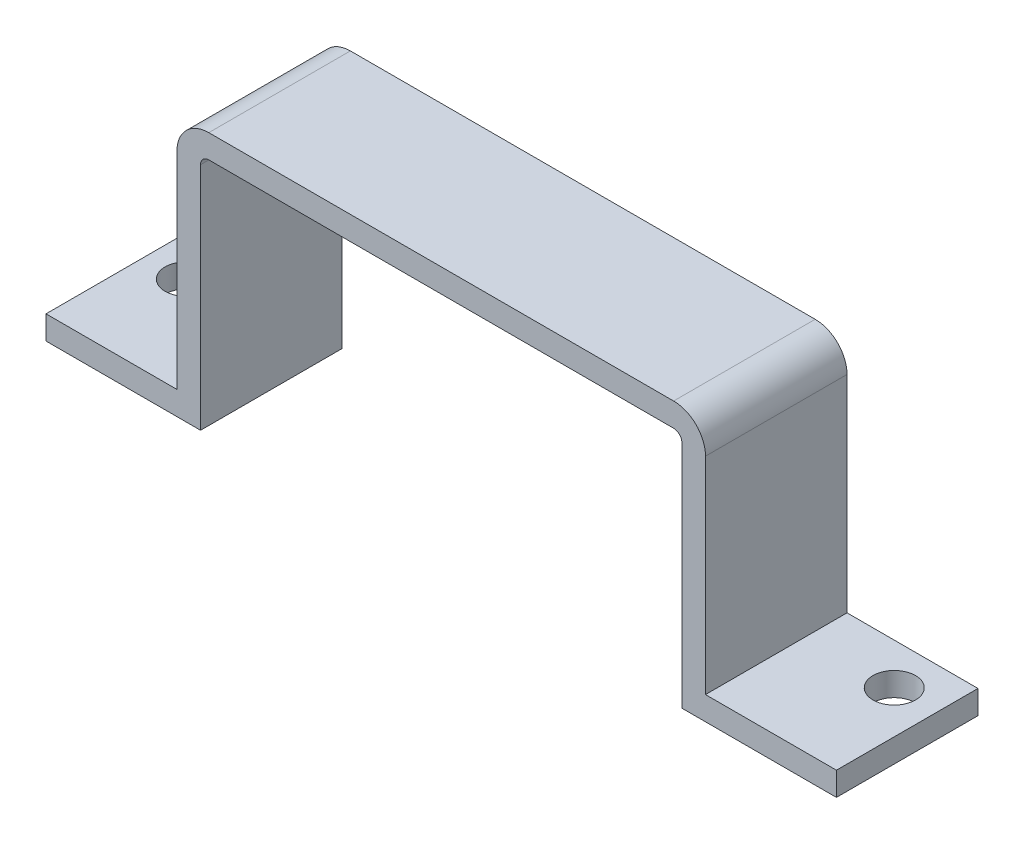
ISO-10303-21;
HEADER;
FILE_DESCRIPTION(('STEP AP214'),'2;1');
FILE_NAME('part.step','',(''),(''),'','','');
FILE_SCHEMA(('AUTOMOTIVE_DESIGN { 1 0 10303 214 1 1 1 1 }'));
ENDSEC;
DATA;
#1=APPLICATION_CONTEXT('core data for automotive mechanical design processes');
#2=APPLICATION_PROTOCOL_DEFINITION('international standard','automotive_design',2000,#1);
#3=PRODUCT_CONTEXT('',#1,'mechanical');
#4=PRODUCT('Part','Part','',(#3));
#5=PRODUCT_RELATED_PRODUCT_CATEGORY('part','',(#4));
#6=PRODUCT_DEFINITION_FORMATION('','',#4);
#7=PRODUCT_DEFINITION_CONTEXT('part definition',#1,'design');
#8=PRODUCT_DEFINITION('design','',#6,#7);
#9=PRODUCT_DEFINITION_SHAPE('','',#8);
#10=(LENGTH_UNIT() NAMED_UNIT(*) SI_UNIT(.MILLI.,.METRE.));
#11=(NAMED_UNIT(*) PLANE_ANGLE_UNIT() SI_UNIT($,.RADIAN.));
#12=(NAMED_UNIT(*) SI_UNIT($,.STERADIAN.) SOLID_ANGLE_UNIT());
#13=UNCERTAINTY_MEASURE_WITH_UNIT(LENGTH_MEASURE(1.E-05),#10,'distance_accuracy_value','');
#14=(GEOMETRIC_REPRESENTATION_CONTEXT(3) GLOBAL_UNCERTAINTY_ASSIGNED_CONTEXT((#13)) GLOBAL_UNIT_ASSIGNED_CONTEXT((#10,
#11,#12)) REPRESENTATION_CONTEXT('',''));
#15=CARTESIAN_POINT('',(0.,0.,0.));
#16=DIRECTION('',(0.,0.,1.));
#17=DIRECTION('',(1.,0.,0.));
#18=AXIS2_PLACEMENT_3D('',#15,#16,#17);
#19=CARTESIAN_POINT('',(25.5972813194356,112.306098212818,770.574147965784));
#20=DIRECTION('',(-2.23996921502586E-08,0.,-1.));
#21=DIRECTION('',(-1.,0.,2.23996921502586E-08));
#22=AXIS2_PLACEMENT_3D('',#19,#20,#21);
#23=CYLINDRICAL_SURFACE('',#22,2.70000000000002);
#24=DIRECTION('',(-2.23996921502586E-08,0.,-1.));
#25=VECTOR('',#24,1.);
#26=CARTESIAN_POINT('',(25.5972813282998,115.006098212818,770.574147965784));
#27=LINE('',#26,#25);
#28=CARTESIAN_POINT('',(25.5972813282998,115.006098212818,699.991997207271));
#29=VERTEX_POINT('',#28);
#30=CARTESIAN_POINT('',(25.597279478485,115.006098212818,687.991997207271));
#31=VERTEX_POINT('',#30);
#32=EDGE_CURVE('E236',#29,#31,#27,.T.);
#33=ORIENTED_EDGE('',*,*,#32,.F.);
#34=CARTESIAN_POINT('',(25.5972797384171,112.306098212818,699.991997207271));
#35=DIRECTION('',(-2.23996921502586E-08,0.,-1.));
#36=DIRECTION('',(-1.,0.,2.23996921502586E-08));
#37=AXIS2_PLACEMENT_3D('',#34,#35,#36);
#38=CIRCLE('',#37,2.70000000000002);
#39=CARTESIAN_POINT('',(28.2972797384172,112.306098204178,699.991997146792));
#40=VERTEX_POINT('',#39);
#41=EDGE_CURVE('E55',#29,#40,#38,.T.);
#42=ORIENTED_EDGE('',*,*,#41,.T.);
#43=DIRECTION('',(-2.23996921502586E-08,0.,-1.));
#44=VECTOR('',#43,1.);
#45=CARTESIAN_POINT('',(28.2972813194356,112.306098204178,770.574147905305));
#46=LINE('',#45,#44);
#47=CARTESIAN_POINT('',(28.2972794696209,112.306098204178,687.991997146792));
#48=VERTEX_POINT('',#47);
#49=EDGE_CURVE('E158',#40,#48,#46,.T.);
#50=ORIENTED_EDGE('',*,*,#49,.T.);
#51=CARTESIAN_POINT('',(25.5972794696208,112.306098212818,687.991997207271));
#52=DIRECTION('',(-2.23996919967956E-08,0.,-1.));
#53=DIRECTION('',(-1.,0.,2.23996919967956E-08));
#54=AXIS2_PLACEMENT_3D('',#51,#52,#53);
#55=CIRCLE('',#54,2.70000000000002);
#56=EDGE_CURVE('E161',#48,#31,#55,.F.);
#57=ORIENTED_EDGE('',*,*,#56,.T.);
#58=EDGE_LOOP('',(#33,#42,#50,#57));
#59=FACE_BOUND('',#58,.T.);
#60=ADVANCED_FACE('F47',(#59),#23,.T.);
#61=CARTESIAN_POINT('',(1.76286485248256E-05,115.006098294731,770.574148539155));
#62=DIRECTION('',(3.20004703784529E-09,1.,0.));
#63=DIRECTION('',(-1.,3.20004703784529E-09,0.));
#64=AXIS2_PLACEMENT_3D('',#61,#62,#63);
#65=PLANE('',#64);
#66=DIRECTION('',(-1.,3.20004703784529E-09,2.23996921502586E-08));
#67=VECTOR('',#66,1.);
#68=CARTESIAN_POINT('',(1.60476300765318E-05,115.006098294731,699.991997780642));
#69=LINE('',#68,#67);
#70=CARTESIAN_POINT('',(-13.8027195971005,115.0060983389,699.991998089819));
#71=VERTEX_POINT('',#70);
#72=EDGE_CURVE('E62',#29,#71,#69,.T.);
#73=ORIENTED_EDGE('',*,*,#72,.F.);
#74=ORIENTED_EDGE('',*,*,#32,.T.);
#75=DIRECTION('',(1.,-3.20004703784529E-09,-2.23996919967956E-08));
#76=VECTOR('',#75,1.);
#77=CARTESIAN_POINT('',(1.57788337707287E-05,115.006098294731,687.991997780642));
#78=LINE('',#77,#76);
#79=CARTESIAN_POINT('',(-13.8027205220079,115.0060983389,687.991998089819));
#80=VERTEX_POINT('',#79);
#81=EDGE_CURVE('E168',#80,#31,#78,.T.);
#82=ORIENTED_EDGE('',*,*,#81,.F.);
#83=DIRECTION('',(-2.23996921502586E-08,0.,-1.));
#84=VECTOR('',#83,1.);
#85=CARTESIAN_POINT('',(-13.8027186721931,115.0060983389,770.574148848332));
#86=LINE('',#85,#84);
#87=EDGE_CURVE('E240',#71,#80,#86,.T.);
#88=ORIENTED_EDGE('',*,*,#87,.F.);
#89=EDGE_LOOP('',(#73,#74,#82,#88));
#90=FACE_BOUND('',#89,.T.);
#91=ADVANCED_FACE('F408',(#90),#65,.T.);
#92=CARTESIAN_POINT('',(-13.8027186805644,112.3060983389,770.574148848332));
#93=DIRECTION('',(-2.23996921502586E-08,0.,-1.));
#94=DIRECTION('',(-1.,0.,2.23996921502586E-08));
#95=AXIS2_PLACEMENT_3D('',#92,#93,#94);
#96=CYLINDRICAL_SURFACE('',#95,2.7);
#97=CARTESIAN_POINT('',(-13.8027202615829,112.3060983389,699.991998089819));
#98=DIRECTION('',(-2.23996921502586E-08,0.,-1.));
#99=DIRECTION('',(-1.,0.,2.23996921502586E-08));
#100=AXIS2_PLACEMENT_3D('',#97,#98,#99);
#101=CIRCLE('',#100,2.7);
#102=CARTESIAN_POINT('',(-16.5027202615829,112.30609834754,699.991998150298));
#103=VERTEX_POINT('',#102);
#104=EDGE_CURVE('E66',#71,#103,#101,.F.);
#105=ORIENTED_EDGE('',*,*,#104,.F.);
#106=ORIENTED_EDGE('',*,*,#87,.T.);
#107=CARTESIAN_POINT('',(-13.8027205303792,112.3060983389,687.991998089819));
#108=DIRECTION('',(-2.23996919967956E-08,0.,-1.));
#109=DIRECTION('',(-1.,0.,2.23996919967956E-08));
#110=AXIS2_PLACEMENT_3D('',#107,#108,#109);
#111=CIRCLE('',#110,2.7);
#112=CARTESIAN_POINT('',(-16.5027205303792,112.30609834754,687.991998150298));
#113=VERTEX_POINT('',#112);
#114=EDGE_CURVE('E232',#113,#80,#111,.T.);
#115=ORIENTED_EDGE('',*,*,#114,.F.);
#116=DIRECTION('',(-2.23996921502586E-08,0.,-1.));
#117=VECTOR('',#116,1.);
#118=CARTESIAN_POINT('',(-16.5027186805644,112.30609834754,770.574148908811));
#119=LINE('',#118,#117);
#120=EDGE_CURVE('E243',#103,#113,#119,.T.);
#121=ORIENTED_EDGE('',*,*,#120,.F.);
#122=EDGE_LOOP('',(#105,#106,#115,#121));
#123=FACE_BOUND('',#122,.T.);
#124=ADVANCED_FACE('F410',(#123),#96,.T.);
#125=CARTESIAN_POINT('',(-16.5027186805644,0.,770.574148908811));
#126=DIRECTION('',(-1.,0.,2.23996921502586E-08));
#127=DIRECTION('',(2.23996921502586E-08,0.,1.));
#128=AXIS2_PLACEMENT_3D('',#125,#126,#127);
#129=PLANE('',#128);
#130=DIRECTION('',(0.,-1.,0.));
#131=VECTOR('',#130,1.);
#132=CARTESIAN_POINT('',(-16.5027202615829,0.,699.991998150298));
#133=LINE('',#132,#131);
#134=CARTESIAN_POINT('',(-16.5027186803404,94.806098383061,699.991998150298));
#135=VERTEX_POINT('',#134);
#136=EDGE_CURVE('E327',#103,#135,#133,.T.);
#137=ORIENTED_EDGE('',*,*,#136,.F.);
#138=ORIENTED_EDGE('',*,*,#120,.T.);
#139=DIRECTION('',(0.,1.,0.));
#140=VECTOR('',#139,1.);
#141=CARTESIAN_POINT('',(-16.5027205303792,0.,687.991998150298));
#142=LINE('',#141,#140);
#143=CARTESIAN_POINT('',(-16.5027205301551,94.806098383061,687.991998150298));
#144=VERTEX_POINT('',#143);
#145=EDGE_CURVE('E228',#144,#113,#142,.T.);
#146=ORIENTED_EDGE('',*,*,#145,.F.);
#147=DIRECTION('',(-2.23996921502586E-08,0.,-1.));
#148=VECTOR('',#147,1.);
#149=CARTESIAN_POINT('',(-16.5027186803404,94.806098383061,770.574148908811));
#150=LINE('',#149,#148);
#151=EDGE_CURVE('E246',#135,#144,#150,.T.);
#152=ORIENTED_EDGE('',*,*,#151,.F.);
#153=EDGE_LOOP('',(#137,#138,#146,#152));
#154=FACE_BOUND('',#153,.T.);
#155=ADVANCED_FACE('F358',(#154),#129,.T.);
#156=CARTESIAN_POINT('',(1.72606236006434E-05,94.806098383061,770.574148539155));
#157=DIRECTION('',(0.,1.,0.));
#158=DIRECTION('',(0.,0.,1.));
#159=AXIS2_PLACEMENT_3D('',#156,#157,#158);
#160=PLANE('',#159);
#161=CARTESIAN_POINT('',(-24.2027204823834,94.806098383061,691.491998322776));
#162=DIRECTION('',(0.,1.,0.));
#163=DIRECTION('',(0.,0.,1.));
#164=AXIS2_PLACEMENT_3D('',#161,#162,#163);
#165=CIRCLE('',#164,1.79999999999999);
#166=CARTESIAN_POINT('',(-24.2027204823834,94.806098383061,693.291998322775));
#167=VERTEX_POINT('',#166);
#168=EDGE_CURVE('E345',#167,#167,#165,.T.);
#169=ORIENTED_EDGE('',*,*,#168,.F.);
#170=EDGE_LOOP('',(#169));
#171=FACE_BOUND('',#170,.T.);
#172=DIRECTION('',(-1.,0.,2.23996921502586E-08));
#173=VECTOR('',#172,1.);
#174=CARTESIAN_POINT('',(1.56796051523496E-05,94.806098383061,699.991997780642));
#175=LINE('',#174,#173);
#176=CARTESIAN_POINT('',(-27.6027202615838,94.806098383061,699.991998398935));
#177=VERTEX_POINT('',#176);
#178=EDGE_CURVE('E324',#135,#177,#175,.T.);
#179=ORIENTED_EDGE('',*,*,#178,.F.);
#180=ORIENTED_EDGE('',*,*,#151,.T.);
#181=DIRECTION('',(1.,0.,-2.23996919967956E-08));
#182=VECTOR('',#181,1.);
#183=CARTESIAN_POINT('',(1.54108088465465E-05,94.806098383061,687.991997780642));
#184=LINE('',#183,#182);
#185=CARTESIAN_POINT('',(-27.6027205303801,94.806098383061,687.991998398935));
#186=VERTEX_POINT('',#185);
#187=EDGE_CURVE('E224',#186,#144,#184,.T.);
#188=ORIENTED_EDGE('',*,*,#187,.F.);
#189=DIRECTION('',(-2.23996921502586E-08,0.,-1.));
#190=VECTOR('',#189,1.);
#191=CARTESIAN_POINT('',(-27.6027186805654,94.806098383061,770.574149157448));
#192=LINE('',#191,#190);
#193=EDGE_CURVE('E249',#177,#186,#192,.T.);
#194=ORIENTED_EDGE('',*,*,#193,.F.);
#195=EDGE_LOOP('',(#179,#180,#188,#194));
#196=FACE_BOUND('',#195,.T.);
#197=ADVANCED_FACE('F354',(#171,#196),#160,.T.);
#198=CARTESIAN_POINT('',(-27.602718680565,0.,770.574149157448));
#199=DIRECTION('',(-1.,0.,2.23996921502586E-08));
#200=DIRECTION('',(2.23996921502586E-08,0.,1.));
#201=AXIS2_PLACEMENT_3D('',#198,#199,#200);
#202=PLANE('',#201);
#203=DIRECTION('',(0.,-1.,0.));
#204=VECTOR('',#203,1.);
#205=CARTESIAN_POINT('',(-27.6027202615835,0.,699.991998398935));
#206=LINE('',#205,#204);
#207=CARTESIAN_POINT('',(-27.6027205303801,92.806098383061,699.991998398935));
#208=VERTEX_POINT('',#207);
#209=EDGE_CURVE('E321',#177,#208,#206,.T.);
#210=ORIENTED_EDGE('',*,*,#209,.F.);
#211=ORIENTED_EDGE('',*,*,#193,.T.);
#212=DIRECTION('',(0.,1.,0.));
#213=VECTOR('',#212,1.);
#214=CARTESIAN_POINT('',(-27.6027205303798,0.,687.991998398935));
#215=LINE('',#214,#213);
#216=CARTESIAN_POINT('',(-27.6027205303801,92.806098383061,687.991998398935));
#217=VERTEX_POINT('',#216);
#218=EDGE_CURVE('E220',#217,#186,#215,.T.);
#219=ORIENTED_EDGE('',*,*,#218,.F.);
#220=DIRECTION('',(-2.23996921502586E-08,0.,-1.));
#221=VECTOR('',#220,1.);
#222=CARTESIAN_POINT('',(-27.6027186805654,92.806098383061,770.574149157448));
#223=LINE('',#222,#221);
#224=EDGE_CURVE('E252',#208,#217,#223,.T.);
#225=ORIENTED_EDGE('',*,*,#224,.F.);
#226=EDGE_LOOP('',(#210,#211,#219,#225));
#227=FACE_BOUND('',#226,.T.);
#228=ADVANCED_FACE('F357',(#227),#202,.T.);
#229=CARTESIAN_POINT('',(1.75576075001544E-05,92.8060982947309,770.574148539155));
#230=DIRECTION('',(3.20004724870396E-09,1.,0.));
#231=DIRECTION('',(-1.,3.20004724870397E-09,0.));
#232=AXIS2_PLACEMENT_3D('',#229,#230,#231);
#233=PLANE('',#232);
#234=CARTESIAN_POINT('',(-24.2027204823834,92.8060982105784,691.491998322776));
#235=DIRECTION('',(0.,1.,0.));
#236=DIRECTION('',(0.,0.,1.));
#237=AXIS2_PLACEMENT_3D('',#234,#235,#236);
#238=CIRCLE('',#237,1.8);
#239=CARTESIAN_POINT('',(-24.2027204823834,92.8060982105784,693.291998322775));
#240=VERTEX_POINT('',#239);
#241=EDGE_CURVE('E340',#240,#240,#238,.T.);
#242=ORIENTED_EDGE('',*,*,#241,.T.);
#243=EDGE_LOOP('',(#242));
#244=FACE_BOUND('',#243,.T.);
#245=DIRECTION('',(-2.23996921502586E-08,0.,-1.));
#246=VECTOR('',#245,1.);
#247=CARTESIAN_POINT('',(-14.5027187413653,92.8060983411404,770.574148864012));
#248=LINE('',#247,#246);
#249=CARTESIAN_POINT('',(-14.5027203239838,92.8060983411404,699.991998105499));
#250=VERTEX_POINT('',#249);
#251=CARTESIAN_POINT('',(-14.5027205911801,92.8060983411404,687.991998105499));
#252=VERTEX_POINT('',#251);
#253=EDGE_CURVE('E255',#250,#252,#248,.T.);
#254=ORIENTED_EDGE('',*,*,#253,.F.);
#255=DIRECTION('',(-1.,3.20004724870397E-09,2.23996921502586E-08));
#256=VECTOR('',#255,1.);
#257=CARTESIAN_POINT('',(1.59765890518606E-05,92.8060982947309,699.991997780642));
#258=LINE('',#257,#256);
#259=EDGE_CURVE('E317',#250,#208,#258,.T.);
#260=ORIENTED_EDGE('',*,*,#259,.T.);
#261=ORIENTED_EDGE('',*,*,#224,.T.);
#262=DIRECTION('',(1.,-3.20004724870397E-09,-2.23996919967956E-08));
#263=VECTOR('',#262,1.);
#264=CARTESIAN_POINT('',(1.57077927460575E-05,92.8060982947309,687.991997780642));
#265=LINE('',#264,#263);
#266=EDGE_CURVE('E200',#217,#252,#265,.T.);
#267=ORIENTED_EDGE('',*,*,#266,.T.);
#268=EDGE_LOOP('',(#254,#260,#261,#267));
#269=FACE_BOUND('',#268,.T.);
#270=ADVANCED_FACE('F377',(#244,#269),#233,.F.);
#271=CARTESIAN_POINT('',(-14.5027190399492,4.64094423990315E-08,770.574148864012));
#272=DIRECTION('',(-1.,3.20004731777395E-09,2.23996921502586E-08));
#273=DIRECTION('',(2.23996921502586E-08,0.,1.));
#274=AXIS2_PLACEMENT_3D('',#271,#272,#273);
#275=PLANE('',#274);
#276=DIRECTION('',(-2.23996921502586E-08,0.,-1.));
#277=VECTOR('',#276,1.);
#278=CARTESIAN_POINT('',(-14.5027186805644,112.30609834114,770.574148864012));
#279=LINE('',#278,#277);
#280=CARTESIAN_POINT('',(-14.5027202615829,112.3060983389,699.991998105499));
#281=VERTEX_POINT('',#280);
#282=CARTESIAN_POINT('',(-14.5027205303792,112.30609834114,687.991998105499));
#283=VERTEX_POINT('',#282);
#284=EDGE_CURVE('E258',#281,#283,#279,.T.);
#285=ORIENTED_EDGE('',*,*,#284,.F.);
#286=DIRECTION('',(-3.20004731777395E-09,-1.,0.));
#287=VECTOR('',#286,1.);
#288=CARTESIAN_POINT('',(-14.5027206209677,4.64094423990302E-08,699.991998105499));
#289=LINE('',#288,#287);
#290=EDGE_CURVE('E313',#281,#250,#289,.T.);
#291=ORIENTED_EDGE('',*,*,#290,.T.);
#292=ORIENTED_EDGE('',*,*,#253,.T.);
#293=DIRECTION('',(3.20004731777395E-09,1.,0.));
#294=VECTOR('',#293,1.);
#295=CARTESIAN_POINT('',(-14.502720889764,4.64094423990299E-08,687.991998105499));
#296=LINE('',#295,#294);
#297=EDGE_CURVE('E216',#252,#283,#296,.T.);
#298=ORIENTED_EDGE('',*,*,#297,.T.);
#299=EDGE_LOOP('',(#285,#291,#292,#298));
#300=FACE_BOUND('',#299,.T.);
#301=ADVANCED_FACE('F380',(#300),#275,.F.);
#302=CARTESIAN_POINT('',(-13.8027186805644,112.3060983389,770.574148848332));
#303=DIRECTION('',(-2.23996921502586E-08,0.,-1.));
#304=DIRECTION('',(-1.,0.,2.23996921502586E-08));
#305=AXIS2_PLACEMENT_3D('',#302,#303,#304);
#306=CYLINDRICAL_SURFACE('',#305,0.699999999999996);
#307=DIRECTION('',(-2.23996921502586E-08,0.,-1.));
#308=VECTOR('',#307,1.);
#309=CARTESIAN_POINT('',(-13.8027186785932,113.0060983389,770.574148848332));
#310=LINE('',#309,#308);
#311=CARTESIAN_POINT('',(-13.802720528408,113.0060983389,699.991998089819));
#312=VERTEX_POINT('',#311);
#313=CARTESIAN_POINT('',(-13.802720528408,113.0060983389,687.991998089819));
#314=VERTEX_POINT('',#313);
#315=EDGE_CURVE('E261',#312,#314,#310,.T.);
#316=ORIENTED_EDGE('',*,*,#315,.F.);
#317=CARTESIAN_POINT('',(-13.8027202615829,112.3060983389,699.991998089819));
#318=DIRECTION('',(-2.23996921502586E-08,0.,-1.));
#319=DIRECTION('',(-1.,0.,2.23996921502586E-08));
#320=AXIS2_PLACEMENT_3D('',#317,#318,#319);
#321=CIRCLE('',#320,0.699999999999996);
#322=EDGE_CURVE('E309',#312,#281,#321,.F.);
#323=ORIENTED_EDGE('',*,*,#322,.T.);
#324=ORIENTED_EDGE('',*,*,#284,.T.);
#325=CARTESIAN_POINT('',(-13.8027205303792,112.3060983389,687.991998089819));
#326=DIRECTION('',(-2.23996919967956E-08,0.,-1.));
#327=DIRECTION('',(-1.,0.,2.23996919967956E-08));
#328=AXIS2_PLACEMENT_3D('',#325,#326,#327);
#329=CIRCLE('',#328,0.699999999999996);
#330=EDGE_CURVE('E212',#283,#314,#329,.T.);
#331=ORIENTED_EDGE('',*,*,#330,.T.);
#332=EDGE_LOOP('',(#316,#323,#324,#331));
#333=FACE_BOUND('',#332,.T.);
#334=ADVANCED_FACE('F384',(#333),#306,.F.);
#335=CARTESIAN_POINT('',(1.76222484307499E-05,113.006098294731,770.574148539155));
#336=DIRECTION('',(3.20004703784529E-09,1.,0.));
#337=DIRECTION('',(-1.,3.20004703784529E-09,0.));
#338=AXIS2_PLACEMENT_3D('',#335,#336,#337);
#339=PLANE('',#338);
#340=DIRECTION('',(-2.23996921502586E-08,0.,-1.));
#341=VECTOR('',#340,1.);
#342=CARTESIAN_POINT('',(25.5972813218997,113.006098212818,770.574147965784));
#343=LINE('',#342,#341);
#344=CARTESIAN_POINT('',(25.5972803969923,113.006098212818,699.991997207271));
#345=VERTEX_POINT('',#344);
#346=CARTESIAN_POINT('',(25.5972794720849,113.006098212818,687.991997207271));
#347=VERTEX_POINT('',#346);
#348=EDGE_CURVE('E264',#345,#347,#343,.T.);
#349=ORIENTED_EDGE('',*,*,#348,.F.);
#350=DIRECTION('',(-1.,3.20004703784529E-09,2.23996921502586E-08));
#351=VECTOR('',#350,1.);
#352=CARTESIAN_POINT('',(1.60412299824561E-05,113.006098294731,699.991997780642));
#353=LINE('',#352,#351);
#354=EDGE_CURVE('E305',#345,#312,#353,.T.);
#355=ORIENTED_EDGE('',*,*,#354,.T.);
#356=ORIENTED_EDGE('',*,*,#315,.T.);
#357=DIRECTION('',(1.,-3.20004703784529E-09,-2.23996919967956E-08));
#358=VECTOR('',#357,1.);
#359=CARTESIAN_POINT('',(1.5772433676653E-05,113.006098294731,687.991997780642));
#360=LINE('',#359,#358);
#361=EDGE_CURVE('E208',#314,#347,#360,.T.);
#362=ORIENTED_EDGE('',*,*,#361,.T.);
#363=EDGE_LOOP('',(#349,#355,#356,#362));
#364=FACE_BOUND('',#363,.T.);
#365=ADVANCED_FACE('F388',(#364),#339,.F.);
#366=CARTESIAN_POINT('',(25.5972813194356,112.306098212818,770.574147965784));
#367=DIRECTION('',(-2.23996921502586E-08,0.,-1.));
#368=DIRECTION('',(-1.,0.,2.23996921502586E-08));
#369=AXIS2_PLACEMENT_3D('',#366,#367,#368);
#370=CYLINDRICAL_SURFACE('',#369,0.70000000000002);
#371=CARTESIAN_POINT('',(25.5972797384171,112.306098212818,699.991997207271));
#372=DIRECTION('',(-2.23996921502586E-08,0.,-1.));
#373=DIRECTION('',(-1.,0.,2.23996921502586E-08));
#374=AXIS2_PLACEMENT_3D('',#371,#372,#373);
#375=CIRCLE('',#374,0.70000000000002);
#376=CARTESIAN_POINT('',(26.2972796776162,112.306098210578,699.991997191591));
#377=VERTEX_POINT('',#376);
#378=EDGE_CURVE('E303',#345,#377,#375,.T.);
#379=ORIENTED_EDGE('',*,*,#378,.F.);
#380=ORIENTED_EDGE('',*,*,#348,.T.);
#381=CARTESIAN_POINT('',(25.5972794696208,112.306098212818,687.991997207271));
#382=DIRECTION('',(-2.23996919967956E-08,0.,-1.));
#383=DIRECTION('',(-1.,0.,2.23996919967956E-08));
#384=AXIS2_PLACEMENT_3D('',#381,#382,#383);
#385=CIRCLE('',#384,0.70000000000002);
#386=CARTESIAN_POINT('',(26.2972794696209,112.306098210578,687.991997191592));
#387=VERTEX_POINT('',#386);
#388=EDGE_CURVE('E204',#387,#347,#385,.F.);
#389=ORIENTED_EDGE('',*,*,#388,.F.);
#390=DIRECTION('',(-2.23996921502586E-08,0.,-1.));
#391=VECTOR('',#390,1.);
#392=CARTESIAN_POINT('',(26.2972813194356,112.306098210578,770.574147950104));
#393=LINE('',#392,#391);
#394=EDGE_CURVE('E267',#377,#387,#393,.T.);
#395=ORIENTED_EDGE('',*,*,#394,.F.);
#396=EDGE_LOOP('',(#379,#380,#389,#395));
#397=FACE_BOUND('',#396,.T.);
#398=ADVANCED_FACE('F392',(#397),#370,.F.);
#399=CARTESIAN_POINT('',(26.2972812586347,0.,770.574147950104));
#400=DIRECTION('',(1.,0.,-2.23996921502586E-08));
#401=DIRECTION('',(-2.23996921502586E-08,0.,-1.));
#402=AXIS2_PLACEMENT_3D('',#399,#400,#401);
#403=PLANE('',#402);
#404=DIRECTION('',(-2.23996921502586E-08,0.,-1.));
#405=VECTOR('',#404,1.);
#406=CARTESIAN_POINT('',(26.2972812586347,92.8060982105784,770.574147950104));
#407=LINE('',#406,#405);
#408=CARTESIAN_POINT('',(26.2972794088199,92.8060982105784,699.991997191591));
#409=VERTEX_POINT('',#408);
#410=CARTESIAN_POINT('',(26.2972794088199,92.8060982105784,687.991997191592));
#411=VERTEX_POINT('',#410);
#412=EDGE_CURVE('E270',#409,#411,#407,.T.);
#413=ORIENTED_EDGE('',*,*,#412,.F.);
#414=DIRECTION('',(0.,1.,0.));
#415=VECTOR('',#414,1.);
#416=CARTESIAN_POINT('',(26.2972796776162,0.,699.991997191591));
#417=LINE('',#416,#415);
#418=EDGE_CURVE('E299',#409,#377,#417,.T.);
#419=ORIENTED_EDGE('',*,*,#418,.T.);
#420=ORIENTED_EDGE('',*,*,#394,.T.);
#421=DIRECTION('',(0.,-1.,0.));
#422=VECTOR('',#421,1.);
#423=CARTESIAN_POINT('',(26.2972794088199,0.,687.991997191592));
#424=LINE('',#423,#422);
#425=EDGE_CURVE('E199',#387,#411,#424,.T.);
#426=ORIENTED_EDGE('',*,*,#425,.T.);
#427=EDGE_LOOP('',(#413,#419,#420,#426));
#428=FACE_BOUND('',#427,.T.);
#429=ADVANCED_FACE('F397',(#428),#403,.F.);
#430=CARTESIAN_POINT('',(35.7972795176166,92.8060982105784,691.491996978793));
#431=DIRECTION('',(0.,1.,0.));
#432=DIRECTION('',(0.,0.,1.));
#433=AXIS2_PLACEMENT_3D('',#430,#431,#432);
#434=CIRCLE('',#433,1.8);
#435=CARTESIAN_POINT('',(35.7972795176166,92.8060982105784,693.291996978793));
#436=VERTEX_POINT('',#435);
#437=EDGE_CURVE('E177',#436,#436,#434,.T.);
#438=ORIENTED_EDGE('',*,*,#437,.T.);
#439=EDGE_LOOP('',(#438));
#440=FACE_BOUND('',#439,.T.);
#441=DIRECTION('',(-2.23996921502586E-08,0.,-1.));
#442=VECTOR('',#441,1.);
#443=CARTESIAN_POINT('',(39.3972813194346,92.8060982758578,770.574147656669));
#444=LINE('',#443,#442);
#445=CARTESIAN_POINT('',(39.3972797384162,92.8060982758578,699.991996898155));
#446=VERTEX_POINT('',#445);
#447=CARTESIAN_POINT('',(39.3972794696199,92.8060982758578,687.991996898156));
#448=VERTEX_POINT('',#447);
#449=EDGE_CURVE('E273',#446,#448,#444,.T.);
#450=ORIENTED_EDGE('',*,*,#449,.F.);
#451=DIRECTION('',(-1.,3.20004724870397E-09,2.23996921502586E-08));
#452=VECTOR('',#451,1.);
#453=CARTESIAN_POINT('',(1.59765890518606E-05,92.8060982947309,699.991997780642));
#454=LINE('',#453,#452);
#455=EDGE_CURVE('E291',#446,#409,#454,.T.);
#456=ORIENTED_EDGE('',*,*,#455,.T.);
#457=ORIENTED_EDGE('',*,*,#412,.T.);
#458=EDGE_CURVE('E195',#411,#448,#265,.T.);
#459=ORIENTED_EDGE('',*,*,#458,.T.);
#460=EDGE_LOOP('',(#450,#456,#457,#459));
#461=FACE_BOUND('',#460,.T.);
#462=ADVANCED_FACE('F402',(#440,#461),#233,.F.);
#463=CARTESIAN_POINT('',(39.3972813194347,0.,770.574147656669));
#464=DIRECTION('',(-1.,0.,2.23996921502586E-08));
#465=DIRECTION('',(2.23996921502586E-08,0.,1.));
#466=AXIS2_PLACEMENT_3D('',#463,#464,#465);
#467=PLANE('',#466);
#468=DIRECTION('',(-2.23996921502586E-08,0.,-1.));
#469=VECTOR('',#468,1.);
#470=CARTESIAN_POINT('',(39.3972813194347,94.8060981686578,770.574147656669));
#471=LINE('',#470,#469);
#472=CARTESIAN_POINT('',(39.3972813194347,94.8060981686578,699.991996898155));
#473=VERTEX_POINT('',#472);
#474=CARTESIAN_POINT('',(39.3972794696199,94.8060981686578,687.991996898156));
#475=VERTEX_POINT('',#474);
#476=EDGE_CURVE('E276',#473,#475,#471,.T.);
#477=ORIENTED_EDGE('',*,*,#476,.F.);
#478=DIRECTION('',(0.,-1.,0.));
#479=VECTOR('',#478,1.);
#480=CARTESIAN_POINT('',(39.3972797384162,0.,699.991996898155));
#481=LINE('',#480,#479);
#482=EDGE_CURVE('E285',#473,#446,#481,.T.);
#483=ORIENTED_EDGE('',*,*,#482,.T.);
#484=ORIENTED_EDGE('',*,*,#449,.T.);
#485=DIRECTION('',(0.,1.,0.));
#486=VECTOR('',#485,1.);
#487=CARTESIAN_POINT('',(39.3972794696199,0.,687.991996898156));
#488=LINE('',#487,#486);
#489=EDGE_CURVE('E188',#448,#475,#488,.T.);
#490=ORIENTED_EDGE('',*,*,#489,.T.);
#491=EDGE_LOOP('',(#477,#483,#484,#490));
#492=FACE_BOUND('',#491,.T.);
#493=ADVANCED_FACE('F404',(#492),#467,.F.);
#494=CARTESIAN_POINT('',(1.72606236006434E-05,94.8060981686578,770.574148539155));
#495=DIRECTION('',(0.,-1.,0.));
#496=DIRECTION('',(0.,0.,-1.));
#497=AXIS2_PLACEMENT_3D('',#494,#495,#496);
#498=PLANE('',#497);
#499=CARTESIAN_POINT('',(35.7972795176166,94.806098383061,691.491996978793));
#500=DIRECTION('',(0.,1.,0.));
#501=DIRECTION('',(0.,0.,1.));
#502=AXIS2_PLACEMENT_3D('',#499,#500,#501);
#503=CIRCLE('',#502,1.79999999999999);
#504=CARTESIAN_POINT('',(35.7972795176166,94.806098383061,693.291996978793));
#505=VERTEX_POINT('',#504);
#506=EDGE_CURVE('E335',#505,#505,#503,.T.);
#507=ORIENTED_EDGE('',*,*,#506,.F.);
#508=EDGE_LOOP('',(#507));
#509=FACE_BOUND('',#508,.T.);
#510=DIRECTION('',(-2.23996921502586E-08,0.,-1.));
#511=VECTOR('',#510,1.);
#512=CARTESIAN_POINT('',(28.2972812631659,94.8060981686578,770.574147905305));
#513=LINE('',#512,#511);
#514=CARTESIAN_POINT('',(28.2972796821475,94.8060981686578,699.991997146792));
#515=VERTEX_POINT('',#514);
#516=CARTESIAN_POINT('',(28.2972794133512,94.8060981686578,687.991997146792));
#517=VERTEX_POINT('',#516);
#518=EDGE_CURVE('E167',#515,#517,#513,.T.);
#519=ORIENTED_EDGE('',*,*,#518,.F.);
#520=DIRECTION('',(1.,0.,-2.23996921502586E-08));
#521=VECTOR('',#520,1.);
#522=CARTESIAN_POINT('',(1.56796051523496E-05,94.8060981686578,699.991997780642));
#523=LINE('',#522,#521);
#524=EDGE_CURVE('E239',#515,#473,#523,.T.);
#525=ORIENTED_EDGE('',*,*,#524,.T.);
#526=ORIENTED_EDGE('',*,*,#476,.T.);
#527=DIRECTION('',(-1.,0.,2.23996919967956E-08));
#528=VECTOR('',#527,1.);
#529=CARTESIAN_POINT('',(1.54108088465465E-05,94.8060981686578,687.991997780642));
#530=LINE('',#529,#528);
#531=EDGE_CURVE('E183',#475,#517,#530,.T.);
#532=ORIENTED_EDGE('',*,*,#531,.T.);
#533=EDGE_LOOP('',(#519,#525,#526,#532));
#534=FACE_BOUND('',#533,.T.);
#535=ADVANCED_FACE('F405',(#509,#534),#498,.F.);
#536=CARTESIAN_POINT('',(28.2972809600508,-9.05525840942236E-08,770.574147905305));
#537=DIRECTION('',(1.,-3.2000473634508E-09,-2.23996921502586E-08));
#538=DIRECTION('',(-2.23996921502586E-08,0.,-1.));
#539=AXIS2_PLACEMENT_3D('',#536,#537,#538);
#540=PLANE('',#539);
#541=DIRECTION('',(3.2000473634508E-09,1.,0.));
#542=VECTOR('',#541,1.);
#543=CARTESIAN_POINT('',(28.2972793790323,-9.05525840942249E-08,699.991997146792));
#544=LINE('',#543,#542);
#545=EDGE_CURVE('E11',#515,#40,#544,.T.);
#546=ORIENTED_EDGE('',*,*,#545,.F.);
#547=ORIENTED_EDGE('',*,*,#518,.T.);
#548=DIRECTION('',(-3.2000473634508E-09,-1.,0.));
#549=VECTOR('',#548,1.);
#550=CARTESIAN_POINT('',(28.297279110236,-9.05525840942252E-08,687.991997146792));
#551=LINE('',#550,#549);
#552=EDGE_CURVE('E173',#48,#517,#551,.T.);
#553=ORIENTED_EDGE('',*,*,#552,.F.);
#554=ORIENTED_EDGE('',*,*,#49,.F.);
#555=EDGE_LOOP('',(#546,#547,#553,#554));
#556=FACE_BOUND('',#555,.T.);
#557=ADVANCED_FACE('F179',(#556),#540,.T.);
#558=CARTESIAN_POINT('',(1.54108088465465E-05,0.,687.991997780642));
#559=DIRECTION('',(-2.23996919967956E-08,0.,-1.));
#560=DIRECTION('',(-1.,0.,2.23996919967956E-08));
#561=AXIS2_PLACEMENT_3D('',#558,#559,#560);
#562=PLANE('',#561);
#563=ORIENTED_EDGE('',*,*,#56,.F.);
#564=ORIENTED_EDGE('',*,*,#552,.T.);
#565=ORIENTED_EDGE('',*,*,#531,.F.);
#566=ORIENTED_EDGE('',*,*,#489,.F.);
#567=ORIENTED_EDGE('',*,*,#458,.F.);
#568=ORIENTED_EDGE('',*,*,#425,.F.);
#569=ORIENTED_EDGE('',*,*,#388,.T.);
#570=ORIENTED_EDGE('',*,*,#361,.F.);
#571=ORIENTED_EDGE('',*,*,#330,.F.);
#572=ORIENTED_EDGE('',*,*,#297,.F.);
#573=ORIENTED_EDGE('',*,*,#266,.F.);
#574=ORIENTED_EDGE('',*,*,#218,.T.);
#575=ORIENTED_EDGE('',*,*,#187,.T.);
#576=ORIENTED_EDGE('',*,*,#145,.T.);
#577=ORIENTED_EDGE('',*,*,#114,.T.);
#578=ORIENTED_EDGE('',*,*,#81,.T.);
#579=EDGE_LOOP('',(#563,#564,#565,#566,#567,#568,#569,#570,#571,#572,#573,#574,#575,#576,#577,#578));
#580=FACE_BOUND('',#579,.T.);
#581=ADVANCED_FACE('F171',(#580),#562,.T.);
#582=CARTESIAN_POINT('',(-94.9527202919805,160.872242576831,699.991999907554));
#583=DIRECTION('',(-2.23996921502586E-08,0.,-1.));
#584=DIRECTION('',(0.,1.,0.));
#585=AXIS2_PLACEMENT_3D('',#582,#583,#584);
#586=PLANE('',#585);
#587=ORIENTED_EDGE('',*,*,#72,.T.);
#588=ORIENTED_EDGE('',*,*,#104,.T.);
#589=ORIENTED_EDGE('',*,*,#136,.T.);
#590=ORIENTED_EDGE('',*,*,#178,.T.);
#591=ORIENTED_EDGE('',*,*,#209,.T.);
#592=ORIENTED_EDGE('',*,*,#259,.F.);
#593=ORIENTED_EDGE('',*,*,#290,.F.);
#594=ORIENTED_EDGE('',*,*,#322,.F.);
#595=ORIENTED_EDGE('',*,*,#354,.F.);
#596=ORIENTED_EDGE('',*,*,#378,.T.);
#597=ORIENTED_EDGE('',*,*,#418,.F.);
#598=ORIENTED_EDGE('',*,*,#455,.F.);
#599=ORIENTED_EDGE('',*,*,#482,.F.);
#600=ORIENTED_EDGE('',*,*,#524,.F.);
#601=ORIENTED_EDGE('',*,*,#545,.T.);
#602=ORIENTED_EDGE('',*,*,#41,.F.);
#603=EDGE_LOOP('',(#587,#588,#589,#590,#591,#592,#593,#594,#595,#596,#597,#598,#599,#600,#601,#602));
#604=FACE_BOUND('',#603,.T.);
#605=ADVANCED_FACE('F374',(#604),#586,.F.);
#606=CARTESIAN_POINT('',(35.7972795176166,94.806098383061,691.491996978793));
#607=DIRECTION('',(0.,1.,0.));
#608=DIRECTION('',(0.,0.,1.));
#609=AXIS2_PLACEMENT_3D('',#606,#607,#608);
#610=CYLINDRICAL_SURFACE('',#609,1.8);
#611=ORIENTED_EDGE('',*,*,#437,.F.);
#612=EDGE_LOOP('',(#611));
#613=FACE_BOUND('',#612,.T.);
#614=ORIENTED_EDGE('',*,*,#506,.T.);
#615=EDGE_LOOP('',(#614));
#616=FACE_BOUND('',#615,.T.);
#617=ADVANCED_FACE('F523',(#613,#616),#610,.F.);
#618=CARTESIAN_POINT('',(-24.2027204823834,94.806098383061,691.491998322776));
#619=DIRECTION('',(0.,1.,0.));
#620=DIRECTION('',(0.,0.,1.));
#621=AXIS2_PLACEMENT_3D('',#618,#619,#620);
#622=CYLINDRICAL_SURFACE('',#621,1.79999999999999);
#623=ORIENTED_EDGE('',*,*,#241,.F.);
#624=EDGE_LOOP('',(#623));
#625=FACE_BOUND('',#624,.T.);
#626=ORIENTED_EDGE('',*,*,#168,.T.);
#627=EDGE_LOOP('',(#626));
#628=FACE_BOUND('',#627,.T.);
#629=ADVANCED_FACE('F352',(#625,#628),#622,.F.);
#630=CLOSED_SHELL('',(#60,#91,#124,#155,#197,#228,#270,#301,#334,#365,#398,#429,#462,#493,#535,
#557,#581,#605,#617,#629));
#631=MANIFOLD_SOLID_BREP('B2',#630);
#632=ADVANCED_BREP_SHAPE_REPRESENTATION('',(#18,#631),#14);
#633=SHAPE_DEFINITION_REPRESENTATION(#9,#632);
ENDSEC;
END-ISO-10303-21;
